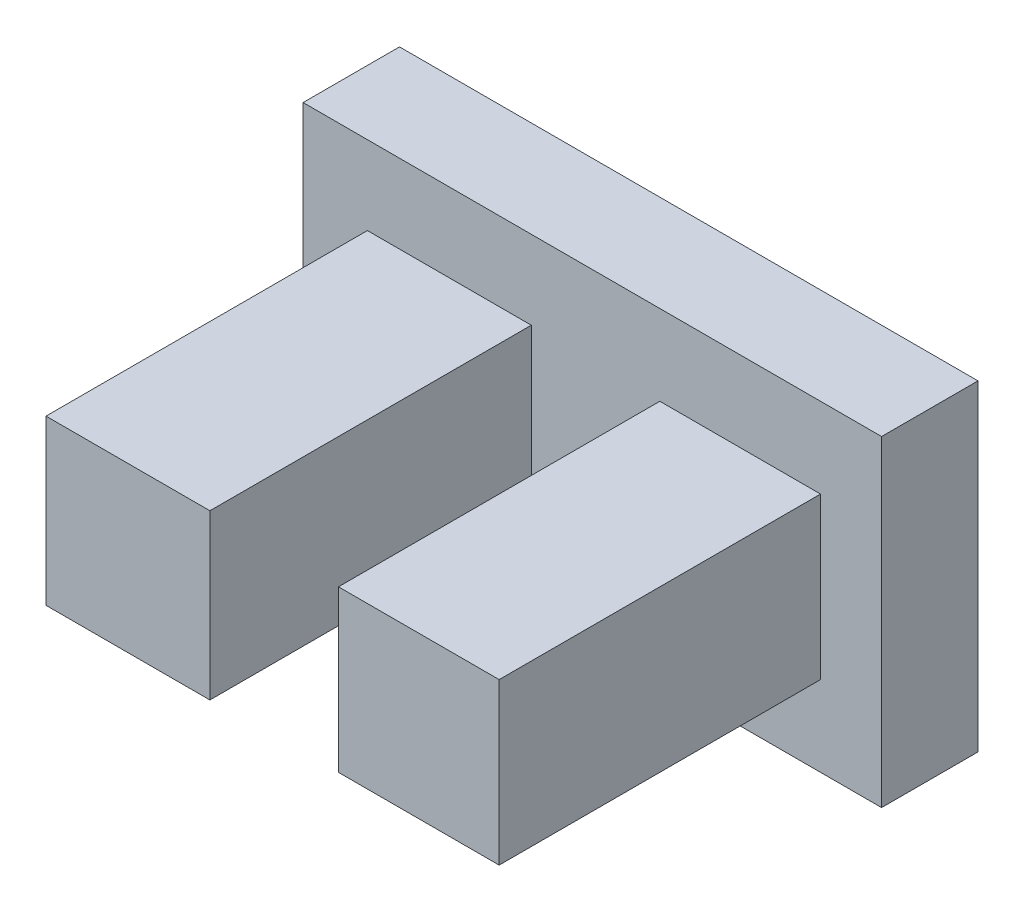
ISO-10303-21;
HEADER;
FILE_DESCRIPTION(('STEP AP214'),'2;1');
FILE_NAME('part.step','',(''),(''),'','','');
FILE_SCHEMA(('AUTOMOTIVE_DESIGN { 1 0 10303 214 1 1 1 1 }'));
ENDSEC;
DATA;
#1=APPLICATION_CONTEXT('core data for automotive mechanical design processes');
#2=APPLICATION_PROTOCOL_DEFINITION('international standard','automotive_design',2000,#1);
#3=PRODUCT_CONTEXT('',#1,'mechanical');
#4=PRODUCT('Part','Part','',(#3));
#5=PRODUCT_RELATED_PRODUCT_CATEGORY('part','',(#4));
#6=PRODUCT_DEFINITION_FORMATION('','',#4);
#7=PRODUCT_DEFINITION_CONTEXT('part definition',#1,'design');
#8=PRODUCT_DEFINITION('design','',#6,#7);
#9=PRODUCT_DEFINITION_SHAPE('','',#8);
#10=(LENGTH_UNIT() NAMED_UNIT(*) SI_UNIT(.MILLI.,.METRE.));
#11=(NAMED_UNIT(*) PLANE_ANGLE_UNIT() SI_UNIT($,.RADIAN.));
#12=(NAMED_UNIT(*) SI_UNIT($,.STERADIAN.) SOLID_ANGLE_UNIT());
#13=UNCERTAINTY_MEASURE_WITH_UNIT(LENGTH_MEASURE(1.E-05),#10,'distance_accuracy_value','');
#14=(GEOMETRIC_REPRESENTATION_CONTEXT(3) GLOBAL_UNCERTAINTY_ASSIGNED_CONTEXT((#13)) GLOBAL_UNIT_ASSIGNED_CONTEXT((#10,
#11,#12)) REPRESENTATION_CONTEXT('',''));
#15=CARTESIAN_POINT('',(0.,0.,0.));
#16=DIRECTION('',(0.,0.,1.));
#17=DIRECTION('',(1.,0.,0.));
#18=AXIS2_PLACEMENT_3D('',#15,#16,#17);
#19=CARTESIAN_POINT('',(0.,0.,1.5));
#20=DIRECTION('',(0.,0.,-1.));
#21=DIRECTION('',(-1.,0.,0.));
#22=AXIS2_PLACEMENT_3D('',#19,#20,#21);
#23=PLANE('',#22);
#24=DIRECTION('',(0.,-1.,0.));
#25=VECTOR('',#24,1.);
#26=CARTESIAN_POINT('',(1.,3.775,1.5));
#27=LINE('',#26,#25);
#28=CARTESIAN_POINT('',(1.,3.775,1.5));
#29=VERTEX_POINT('',#28);
#30=CARTESIAN_POINT('',(1.,1.225,1.5));
#31=VERTEX_POINT('',#30);
#32=EDGE_CURVE('E143',#29,#31,#27,.T.);
#33=ORIENTED_EDGE('',*,*,#32,.F.);
#34=DIRECTION('',(-1.,0.,0.));
#35=VECTOR('',#34,1.);
#36=CARTESIAN_POINT('',(1.,3.775,1.5));
#37=LINE('',#36,#35);
#38=CARTESIAN_POINT('',(3.55,3.775,1.5));
#39=VERTEX_POINT('',#38);
#40=EDGE_CURVE('E156',#39,#29,#37,.T.);
#41=ORIENTED_EDGE('',*,*,#40,.F.);
#42=DIRECTION('',(0.,1.,0.));
#43=VECTOR('',#42,1.);
#44=CARTESIAN_POINT('',(3.55,3.775,1.5));
#45=LINE('',#44,#43);
#46=CARTESIAN_POINT('',(3.55,1.225,1.5));
#47=VERTEX_POINT('',#46);
#48=EDGE_CURVE('E165',#47,#39,#45,.T.);
#49=ORIENTED_EDGE('',*,*,#48,.F.);
#50=DIRECTION('',(1.,0.,0.));
#51=VECTOR('',#50,1.);
#52=CARTESIAN_POINT('',(1.,1.225,1.5));
#53=LINE('',#52,#51);
#54=EDGE_CURVE('E146',#31,#47,#53,.T.);
#55=ORIENTED_EDGE('',*,*,#54,.F.);
#56=EDGE_LOOP('',(#33,#41,#49,#55));
#57=FACE_BOUND('',#56,.T.);
#58=DIRECTION('',(0.,-1.,0.));
#59=VECTOR('',#58,1.);
#60=CARTESIAN_POINT('',(0.,0.,1.5));
#61=LINE('',#60,#59);
#62=CARTESIAN_POINT('',(0.,5.,1.5));
#63=VERTEX_POINT('',#62);
#64=CARTESIAN_POINT('',(0.,0.,1.5));
#65=VERTEX_POINT('',#64);
#66=EDGE_CURVE('E182',#63,#65,#61,.T.);
#67=ORIENTED_EDGE('',*,*,#66,.T.);
#68=DIRECTION('',(1.,0.,0.));
#69=VECTOR('',#68,1.);
#70=CARTESIAN_POINT('',(0.,0.,1.5));
#71=LINE('',#70,#69);
#72=CARTESIAN_POINT('',(9.,0.,1.5));
#73=VERTEX_POINT('',#72);
#74=EDGE_CURVE('E185',#65,#73,#71,.T.);
#75=ORIENTED_EDGE('',*,*,#74,.T.);
#76=DIRECTION('',(0.,1.,0.));
#77=VECTOR('',#76,1.);
#78=CARTESIAN_POINT('',(9.,0.,1.5));
#79=LINE('',#78,#77);
#80=CARTESIAN_POINT('',(9.,5.,1.5));
#81=VERTEX_POINT('',#80);
#82=EDGE_CURVE('E188',#73,#81,#79,.T.);
#83=ORIENTED_EDGE('',*,*,#82,.T.);
#84=DIRECTION('',(-1.,0.,0.));
#85=VECTOR('',#84,1.);
#86=CARTESIAN_POINT('',(0.,5.,1.5));
#87=LINE('',#86,#85);
#88=EDGE_CURVE('E190',#81,#63,#87,.T.);
#89=ORIENTED_EDGE('',*,*,#88,.T.);
#90=EDGE_LOOP('',(#67,#75,#83,#89));
#91=FACE_BOUND('',#90,.T.);
#92=DIRECTION('',(0.,-1.,0.));
#93=VECTOR('',#92,1.);
#94=CARTESIAN_POINT('',(5.55,3.75,1.5));
#95=LINE('',#94,#93);
#96=CARTESIAN_POINT('',(5.55,3.75,1.5));
#97=VERTEX_POINT('',#96);
#98=CARTESIAN_POINT('',(5.55,1.25,1.5));
#99=VERTEX_POINT('',#98);
#100=EDGE_CURVE('E142',#97,#99,#95,.T.);
#101=ORIENTED_EDGE('',*,*,#100,.F.);
#102=DIRECTION('',(-1.,0.,0.));
#103=VECTOR('',#102,1.);
#104=CARTESIAN_POINT('',(5.55,3.75,1.5));
#105=LINE('',#104,#103);
#106=CARTESIAN_POINT('',(8.05,3.75,1.5));
#107=VERTEX_POINT('',#106);
#108=EDGE_CURVE('E139',#107,#97,#105,.T.);
#109=ORIENTED_EDGE('',*,*,#108,.F.);
#110=DIRECTION('',(0.,1.,0.));
#111=VECTOR('',#110,1.);
#112=CARTESIAN_POINT('',(8.05,3.75,1.5));
#113=LINE('',#112,#111);
#114=CARTESIAN_POINT('',(8.05,1.25,1.5));
#115=VERTEX_POINT('',#114);
#116=EDGE_CURVE('E53',#115,#107,#113,.T.);
#117=ORIENTED_EDGE('',*,*,#116,.F.);
#118=DIRECTION('',(1.,0.,0.));
#119=VECTOR('',#118,1.);
#120=CARTESIAN_POINT('',(5.55,1.25,1.5));
#121=LINE('',#120,#119);
#122=EDGE_CURVE('E48',#99,#115,#121,.T.);
#123=ORIENTED_EDGE('',*,*,#122,.F.);
#124=EDGE_LOOP('',(#101,#109,#117,#123));
#125=FACE_BOUND('',#124,.T.);
#126=ADVANCED_FACE('F33',(#57,#91,#125),#23,.F.);
#127=CARTESIAN_POINT('',(0.,0.,1.5));
#128=DIRECTION('',(1.,0.,0.));
#129=DIRECTION('',(0.,0.,-1.));
#130=AXIS2_PLACEMENT_3D('',#127,#128,#129);
#131=PLANE('',#130);
#132=DIRECTION('',(0.,-1.,0.));
#133=VECTOR('',#132,1.);
#134=CARTESIAN_POINT('',(0.,0.,0.));
#135=LINE('',#134,#133);
#136=CARTESIAN_POINT('',(0.,5.,0.));
#137=VERTEX_POINT('',#136);
#138=CARTESIAN_POINT('',(0.,0.,0.));
#139=VERTEX_POINT('',#138);
#140=EDGE_CURVE('E181',#137,#139,#135,.T.);
#141=ORIENTED_EDGE('',*,*,#140,.T.);
#142=DIRECTION('',(0.,0.,-1.));
#143=VECTOR('',#142,1.);
#144=CARTESIAN_POINT('',(0.,0.,1.5));
#145=LINE('',#144,#143);
#146=EDGE_CURVE('E11',#65,#139,#145,.T.);
#147=ORIENTED_EDGE('',*,*,#146,.F.);
#148=ORIENTED_EDGE('',*,*,#66,.F.);
#149=DIRECTION('',(0.,0.,-1.));
#150=VECTOR('',#149,1.);
#151=CARTESIAN_POINT('',(0.,5.,1.5));
#152=LINE('',#151,#150);
#153=EDGE_CURVE('E192',#63,#137,#152,.T.);
#154=ORIENTED_EDGE('',*,*,#153,.T.);
#155=EDGE_LOOP('',(#141,#147,#148,#154));
#156=FACE_BOUND('',#155,.T.);
#157=ADVANCED_FACE('F35',(#156),#131,.F.);
#158=CARTESIAN_POINT('',(0.,0.,1.5));
#159=DIRECTION('',(0.,1.,0.));
#160=DIRECTION('',(0.,0.,1.));
#161=AXIS2_PLACEMENT_3D('',#158,#159,#160);
#162=PLANE('',#161);
#163=DIRECTION('',(1.,0.,0.));
#164=VECTOR('',#163,1.);
#165=CARTESIAN_POINT('',(0.,0.,0.));
#166=LINE('',#165,#164);
#167=CARTESIAN_POINT('',(9.,0.,0.));
#168=VERTEX_POINT('',#167);
#169=EDGE_CURVE('E195',#139,#168,#166,.T.);
#170=ORIENTED_EDGE('',*,*,#169,.T.);
#171=DIRECTION('',(0.,0.,-1.));
#172=VECTOR('',#171,1.);
#173=CARTESIAN_POINT('',(9.,0.,1.5));
#174=LINE('',#173,#172);
#175=EDGE_CURVE('E41',#73,#168,#174,.T.);
#176=ORIENTED_EDGE('',*,*,#175,.F.);
#177=ORIENTED_EDGE('',*,*,#74,.F.);
#178=ORIENTED_EDGE('',*,*,#146,.T.);
#179=EDGE_LOOP('',(#170,#176,#177,#178));
#180=FACE_BOUND('',#179,.T.);
#181=ADVANCED_FACE('F224',(#180),#162,.F.);
#182=CARTESIAN_POINT('',(9.,0.,1.5));
#183=DIRECTION('',(-1.,0.,0.));
#184=DIRECTION('',(0.,0.,1.));
#185=AXIS2_PLACEMENT_3D('',#182,#183,#184);
#186=PLANE('',#185);
#187=DIRECTION('',(0.,1.,0.));
#188=VECTOR('',#187,1.);
#189=CARTESIAN_POINT('',(9.,0.,0.));
#190=LINE('',#189,#188);
#191=CARTESIAN_POINT('',(9.,5.,0.));
#192=VERTEX_POINT('',#191);
#193=EDGE_CURVE('E197',#168,#192,#190,.T.);
#194=ORIENTED_EDGE('',*,*,#193,.T.);
#195=DIRECTION('',(0.,0.,-1.));
#196=VECTOR('',#195,1.);
#197=CARTESIAN_POINT('',(9.,5.,1.5));
#198=LINE('',#197,#196);
#199=EDGE_CURVE('E202',#81,#192,#198,.T.);
#200=ORIENTED_EDGE('',*,*,#199,.F.);
#201=ORIENTED_EDGE('',*,*,#82,.F.);
#202=ORIENTED_EDGE('',*,*,#175,.T.);
#203=EDGE_LOOP('',(#194,#200,#201,#202));
#204=FACE_BOUND('',#203,.T.);
#205=ADVANCED_FACE('F209',(#204),#186,.F.);
#206=CARTESIAN_POINT('',(0.,5.,1.5));
#207=DIRECTION('',(0.,-1.,0.));
#208=DIRECTION('',(0.,0.,-1.));
#209=AXIS2_PLACEMENT_3D('',#206,#207,#208);
#210=PLANE('',#209);
#211=DIRECTION('',(-1.,0.,0.));
#212=VECTOR('',#211,1.);
#213=CARTESIAN_POINT('',(0.,5.,0.));
#214=LINE('',#213,#212);
#215=EDGE_CURVE('E186',#192,#137,#214,.T.);
#216=ORIENTED_EDGE('',*,*,#215,.T.);
#217=ORIENTED_EDGE('',*,*,#153,.F.);
#218=ORIENTED_EDGE('',*,*,#88,.F.);
#219=ORIENTED_EDGE('',*,*,#199,.T.);
#220=EDGE_LOOP('',(#216,#217,#218,#219));
#221=FACE_BOUND('',#220,.T.);
#222=ADVANCED_FACE('F218',(#221),#210,.F.);
#223=CARTESIAN_POINT('',(0.,0.,0.));
#224=DIRECTION('',(0.,0.,-1.));
#225=DIRECTION('',(-1.,0.,0.));
#226=AXIS2_PLACEMENT_3D('',#223,#224,#225);
#227=PLANE('',#226);
#228=ORIENTED_EDGE('',*,*,#140,.F.);
#229=ORIENTED_EDGE('',*,*,#215,.F.);
#230=ORIENTED_EDGE('',*,*,#193,.F.);
#231=ORIENTED_EDGE('',*,*,#169,.F.);
#232=EDGE_LOOP('',(#228,#229,#230,#231));
#233=FACE_BOUND('',#232,.T.);
#234=ADVANCED_FACE('F215',(#233),#227,.T.);
#235=CARTESIAN_POINT('',(1.,3.775,6.5));
#236=DIRECTION('',(1.,0.,0.));
#237=DIRECTION('',(0.,1.,0.));
#238=AXIS2_PLACEMENT_3D('',#235,#236,#237);
#239=PLANE('',#238);
#240=ORIENTED_EDGE('',*,*,#32,.T.);
#241=DIRECTION('',(0.,0.,-1.));
#242=VECTOR('',#241,1.);
#243=CARTESIAN_POINT('',(1.,1.225,6.5));
#244=LINE('',#243,#242);
#245=CARTESIAN_POINT('',(1.,1.225,6.5));
#246=VERTEX_POINT('',#245);
#247=EDGE_CURVE('E178',#246,#31,#244,.T.);
#248=ORIENTED_EDGE('',*,*,#247,.F.);
#249=DIRECTION('',(0.,-1.,0.));
#250=VECTOR('',#249,1.);
#251=CARTESIAN_POINT('',(1.,3.775,6.5));
#252=LINE('',#251,#250);
#253=CARTESIAN_POINT('',(1.,3.775,6.5));
#254=VERTEX_POINT('',#253);
#255=EDGE_CURVE('E152',#254,#246,#252,.T.);
#256=ORIENTED_EDGE('',*,*,#255,.F.);
#257=DIRECTION('',(0.,0.,-1.));
#258=VECTOR('',#257,1.);
#259=CARTESIAN_POINT('',(1.,3.775,6.5));
#260=LINE('',#259,#258);
#261=EDGE_CURVE('E161',#254,#29,#260,.T.);
#262=ORIENTED_EDGE('',*,*,#261,.T.);
#263=EDGE_LOOP('',(#240,#248,#256,#262));
#264=FACE_BOUND('',#263,.T.);
#265=ADVANCED_FACE('F238',(#264),#239,.F.);
#266=CARTESIAN_POINT('',(1.,1.225,6.5));
#267=DIRECTION('',(0.,1.,0.));
#268=DIRECTION('',(0.,0.,1.));
#269=AXIS2_PLACEMENT_3D('',#266,#267,#268);
#270=PLANE('',#269);
#271=ORIENTED_EDGE('',*,*,#54,.T.);
#272=DIRECTION('',(0.,0.,-1.));
#273=VECTOR('',#272,1.);
#274=CARTESIAN_POINT('',(3.55,1.225,6.5));
#275=LINE('',#274,#273);
#276=CARTESIAN_POINT('',(3.55,1.225,6.5));
#277=VERTEX_POINT('',#276);
#278=EDGE_CURVE('E175',#277,#47,#275,.T.);
#279=ORIENTED_EDGE('',*,*,#278,.F.);
#280=DIRECTION('',(1.,0.,0.));
#281=VECTOR('',#280,1.);
#282=CARTESIAN_POINT('',(1.,1.225,6.5));
#283=LINE('',#282,#281);
#284=EDGE_CURVE('E155',#246,#277,#283,.T.);
#285=ORIENTED_EDGE('',*,*,#284,.F.);
#286=ORIENTED_EDGE('',*,*,#247,.T.);
#287=EDGE_LOOP('',(#271,#279,#285,#286));
#288=FACE_BOUND('',#287,.T.);
#289=ADVANCED_FACE('F257',(#288),#270,.F.);
#290=CARTESIAN_POINT('',(3.55,3.775,6.5));
#291=DIRECTION('',(-1.,0.,0.));
#292=DIRECTION('',(0.,-1.,0.));
#293=AXIS2_PLACEMENT_3D('',#290,#291,#292);
#294=PLANE('',#293);
#295=ORIENTED_EDGE('',*,*,#48,.T.);
#296=DIRECTION('',(0.,0.,-1.));
#297=VECTOR('',#296,1.);
#298=CARTESIAN_POINT('',(3.55,3.775,6.5));
#299=LINE('',#298,#297);
#300=CARTESIAN_POINT('',(3.55,3.775,6.5));
#301=VERTEX_POINT('',#300);
#302=EDGE_CURVE('E172',#301,#39,#299,.T.);
#303=ORIENTED_EDGE('',*,*,#302,.F.);
#304=DIRECTION('',(0.,1.,0.));
#305=VECTOR('',#304,1.);
#306=CARTESIAN_POINT('',(3.55,3.775,6.5));
#307=LINE('',#306,#305);
#308=EDGE_CURVE('E158',#277,#301,#307,.T.);
#309=ORIENTED_EDGE('',*,*,#308,.F.);
#310=ORIENTED_EDGE('',*,*,#278,.T.);
#311=EDGE_LOOP('',(#295,#303,#309,#310));
#312=FACE_BOUND('',#311,.T.);
#313=ADVANCED_FACE('F264',(#312),#294,.F.);
#314=CARTESIAN_POINT('',(1.,3.775,6.5));
#315=DIRECTION('',(0.,-1.,0.));
#316=DIRECTION('',(0.,0.,-1.));
#317=AXIS2_PLACEMENT_3D('',#314,#315,#316);
#318=PLANE('',#317);
#319=ORIENTED_EDGE('',*,*,#40,.T.);
#320=ORIENTED_EDGE('',*,*,#261,.F.);
#321=DIRECTION('',(-1.,0.,0.));
#322=VECTOR('',#321,1.);
#323=CARTESIAN_POINT('',(1.,3.775,6.5));
#324=LINE('',#323,#322);
#325=EDGE_CURVE('E160',#301,#254,#324,.T.);
#326=ORIENTED_EDGE('',*,*,#325,.F.);
#327=ORIENTED_EDGE('',*,*,#302,.T.);
#328=EDGE_LOOP('',(#319,#320,#326,#327));
#329=FACE_BOUND('',#328,.T.);
#330=ADVANCED_FACE('F271',(#329),#318,.F.);
#331=CARTESIAN_POINT('',(0.,0.,6.5));
#332=DIRECTION('',(0.,0.,1.));
#333=DIRECTION('',(1.,0.,0.));
#334=AXIS2_PLACEMENT_3D('',#331,#332,#333);
#335=PLANE('',#334);
#336=ORIENTED_EDGE('',*,*,#255,.T.);
#337=ORIENTED_EDGE('',*,*,#284,.T.);
#338=ORIENTED_EDGE('',*,*,#308,.T.);
#339=ORIENTED_EDGE('',*,*,#325,.T.);
#340=EDGE_LOOP('',(#336,#337,#338,#339));
#341=FACE_BOUND('',#340,.T.);
#342=ADVANCED_FACE('F279',(#341),#335,.T.);
#343=CARTESIAN_POINT('',(5.55,3.75,6.5));
#344=DIRECTION('',(1.,0.,0.));
#345=DIRECTION('',(0.,0.,-1.));
#346=AXIS2_PLACEMENT_3D('',#343,#344,#345);
#347=PLANE('',#346);
#348=ORIENTED_EDGE('',*,*,#100,.T.);
#349=DIRECTION('',(0.,0.,-1.));
#350=VECTOR('',#349,1.);
#351=CARTESIAN_POINT('',(5.55,1.25,6.5));
#352=LINE('',#351,#350);
#353=CARTESIAN_POINT('',(5.55,1.25,6.5));
#354=VERTEX_POINT('',#353);
#355=EDGE_CURVE('E123',#354,#99,#352,.T.);
#356=ORIENTED_EDGE('',*,*,#355,.F.);
#357=DIRECTION('',(0.,-1.,0.));
#358=VECTOR('',#357,1.);
#359=CARTESIAN_POINT('',(5.55,3.75,6.5));
#360=LINE('',#359,#358);
#361=CARTESIAN_POINT('',(5.55,3.75,6.5));
#362=VERTEX_POINT('',#361);
#363=EDGE_CURVE('E130',#362,#354,#360,.T.);
#364=ORIENTED_EDGE('',*,*,#363,.F.);
#365=DIRECTION('',(0.,0.,-1.));
#366=VECTOR('',#365,1.);
#367=CARTESIAN_POINT('',(5.55,3.75,6.5));
#368=LINE('',#367,#366);
#369=EDGE_CURVE('E368',#362,#97,#368,.T.);
#370=ORIENTED_EDGE('',*,*,#369,.T.);
#371=EDGE_LOOP('',(#348,#356,#364,#370));
#372=FACE_BOUND('',#371,.T.);
#373=ADVANCED_FACE('F141',(#372),#347,.F.);
#374=CARTESIAN_POINT('',(5.55,1.25,6.5));
#375=DIRECTION('',(0.,1.,0.));
#376=DIRECTION('',(0.,0.,1.));
#377=AXIS2_PLACEMENT_3D('',#374,#375,#376);
#378=PLANE('',#377);
#379=ORIENTED_EDGE('',*,*,#122,.T.);
#380=DIRECTION('',(0.,0.,-1.));
#381=VECTOR('',#380,1.);
#382=CARTESIAN_POINT('',(8.05,1.25,6.5));
#383=LINE('',#382,#381);
#384=CARTESIAN_POINT('',(8.05,1.25,6.5));
#385=VERTEX_POINT('',#384);
#386=EDGE_CURVE('E126',#385,#115,#383,.T.);
#387=ORIENTED_EDGE('',*,*,#386,.F.);
#388=DIRECTION('',(1.,0.,0.));
#389=VECTOR('',#388,1.);
#390=CARTESIAN_POINT('',(5.55,1.25,6.5));
#391=LINE('',#390,#389);
#392=EDGE_CURVE('E119',#354,#385,#391,.T.);
#393=ORIENTED_EDGE('',*,*,#392,.F.);
#394=ORIENTED_EDGE('',*,*,#355,.T.);
#395=EDGE_LOOP('',(#379,#387,#393,#394));
#396=FACE_BOUND('',#395,.T.);
#397=ADVANCED_FACE('F121',(#396),#378,.F.);
#398=CARTESIAN_POINT('',(8.05,3.75,6.5));
#399=DIRECTION('',(-1.,0.,0.));
#400=DIRECTION('',(0.,0.,1.));
#401=AXIS2_PLACEMENT_3D('',#398,#399,#400);
#402=PLANE('',#401);
#403=ORIENTED_EDGE('',*,*,#116,.T.);
#404=DIRECTION('',(0.,0.,-1.));
#405=VECTOR('',#404,1.);
#406=CARTESIAN_POINT('',(8.05,3.75,6.5));
#407=LINE('',#406,#405);
#408=CARTESIAN_POINT('',(8.05,3.75,6.5));
#409=VERTEX_POINT('',#408);
#410=EDGE_CURVE('E148',#409,#107,#407,.T.);
#411=ORIENTED_EDGE('',*,*,#410,.F.);
#412=DIRECTION('',(0.,1.,0.));
#413=VECTOR('',#412,1.);
#414=CARTESIAN_POINT('',(8.05,3.75,6.5));
#415=LINE('',#414,#413);
#416=EDGE_CURVE('E129',#385,#409,#415,.T.);
#417=ORIENTED_EDGE('',*,*,#416,.F.);
#418=ORIENTED_EDGE('',*,*,#386,.T.);
#419=EDGE_LOOP('',(#403,#411,#417,#418));
#420=FACE_BOUND('',#419,.T.);
#421=ADVANCED_FACE('F300',(#420),#402,.F.);
#422=CARTESIAN_POINT('',(5.55,3.75,6.5));
#423=DIRECTION('',(0.,-1.,0.));
#424=DIRECTION('',(0.,0.,-1.));
#425=AXIS2_PLACEMENT_3D('',#422,#423,#424);
#426=PLANE('',#425);
#427=ORIENTED_EDGE('',*,*,#108,.T.);
#428=ORIENTED_EDGE('',*,*,#369,.F.);
#429=DIRECTION('',(-1.,0.,0.));
#430=VECTOR('',#429,1.);
#431=CARTESIAN_POINT('',(5.55,3.75,6.5));
#432=LINE('',#431,#430);
#433=EDGE_CURVE('E135',#409,#362,#432,.T.);
#434=ORIENTED_EDGE('',*,*,#433,.F.);
#435=ORIENTED_EDGE('',*,*,#410,.T.);
#436=EDGE_LOOP('',(#427,#428,#434,#435));
#437=FACE_BOUND('',#436,.T.);
#438=ADVANCED_FACE('F307',(#437),#426,.F.);
#439=CARTESIAN_POINT('',(0.,0.,6.5));
#440=DIRECTION('',(0.,0.,1.));
#441=DIRECTION('',(1.,0.,0.));
#442=AXIS2_PLACEMENT_3D('',#439,#440,#441);
#443=PLANE('',#442);
#444=ORIENTED_EDGE('',*,*,#363,.T.);
#445=ORIENTED_EDGE('',*,*,#392,.T.);
#446=ORIENTED_EDGE('',*,*,#416,.T.);
#447=ORIENTED_EDGE('',*,*,#433,.T.);
#448=EDGE_LOOP('',(#444,#445,#446,#447));
#449=FACE_BOUND('',#448,.T.);
#450=ADVANCED_FACE('F133',(#449),#443,.T.);
#451=CLOSED_SHELL('',(#126,#157,#181,#205,#222,#234,#265,#289,#313,#330,#342,#373,#397,#421,
#438,#450));
#452=MANIFOLD_SOLID_BREP('B2',#451);
#453=ADVANCED_BREP_SHAPE_REPRESENTATION('',(#18,#452),#14);
#454=SHAPE_DEFINITION_REPRESENTATION(#9,#453);
ENDSEC;
END-ISO-10303-21;
